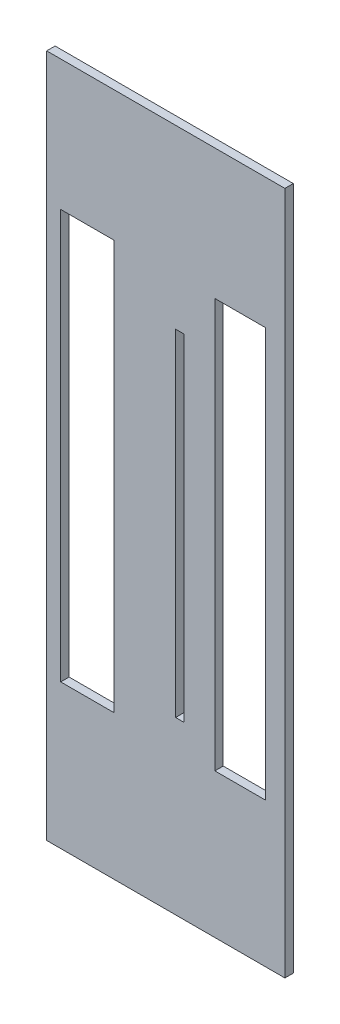
ISO-10303-21;
HEADER;
FILE_DESCRIPTION(('STEP AP214'),'2;1');
FILE_NAME('part.step','',(''),(''),'','','');
FILE_SCHEMA(('AUTOMOTIVE_DESIGN { 1 0 10303 214 1 1 1 1 }'));
ENDSEC;
DATA;
#1=APPLICATION_CONTEXT('core data for automotive mechanical design processes');
#2=APPLICATION_PROTOCOL_DEFINITION('international standard','automotive_design',2000,#1);
#3=PRODUCT_CONTEXT('',#1,'mechanical');
#4=PRODUCT('Part','Part','',(#3));
#5=PRODUCT_RELATED_PRODUCT_CATEGORY('part','',(#4));
#6=PRODUCT_DEFINITION_FORMATION('','',#4);
#7=PRODUCT_DEFINITION_CONTEXT('part definition',#1,'design');
#8=PRODUCT_DEFINITION('design','',#6,#7);
#9=PRODUCT_DEFINITION_SHAPE('','',#8);
#10=(LENGTH_UNIT() NAMED_UNIT(*) SI_UNIT(.MILLI.,.METRE.));
#11=(NAMED_UNIT(*) PLANE_ANGLE_UNIT() SI_UNIT($,.RADIAN.));
#12=(NAMED_UNIT(*) SI_UNIT($,.STERADIAN.) SOLID_ANGLE_UNIT());
#13=UNCERTAINTY_MEASURE_WITH_UNIT(LENGTH_MEASURE(1.E-05),#10,'distance_accuracy_value','');
#14=(GEOMETRIC_REPRESENTATION_CONTEXT(3) GLOBAL_UNCERTAINTY_ASSIGNED_CONTEXT((#13)) GLOBAL_UNIT_ASSIGNED_CONTEXT((#10,
#11,#12)) REPRESENTATION_CONTEXT('',''));
#15=CARTESIAN_POINT('',(0.,0.,0.));
#16=DIRECTION('',(0.,0.,1.));
#17=DIRECTION('',(1.,0.,0.));
#18=AXIS2_PLACEMENT_3D('',#15,#16,#17);
#19=CARTESIAN_POINT('',(193.,254.5,160.));
#20=DIRECTION('',(0.,0.,-1.));
#21=DIRECTION('',(-1.,0.,0.));
#22=AXIS2_PLACEMENT_3D('',#19,#20,#21);
#23=PLANE('',#22);
#24=DIRECTION('',(0.,1.,0.));
#25=VECTOR('',#24,1.);
#26=CARTESIAN_POINT('',(208.,81.4999999999999,160.));
#27=LINE('',#26,#25);
#28=CARTESIAN_POINT('',(208.,203.5,160.));
#29=VERTEX_POINT('',#28);
#30=CARTESIAN_POINT('',(208.,57.4999999999999,160.));
#31=VERTEX_POINT('',#30);
#32=EDGE_CURVE('E176',#29,#31,#27,.F.);
#33=ORIENTED_EDGE('',*,*,#32,.T.);
#34=DIRECTION('',(1.,0.,0.));
#35=VECTOR('',#34,1.);
#36=CARTESIAN_POINT('',(240.,57.4999999999999,160.));
#37=LINE('',#36,#35);
#38=CARTESIAN_POINT('',(227.,57.4999999999999,160.));
#39=VERTEX_POINT('',#38);
#40=EDGE_CURVE('E190',#39,#31,#37,.F.);
#41=ORIENTED_EDGE('',*,*,#40,.F.);
#42=DIRECTION('',(0.,1.,0.));
#43=VECTOR('',#42,1.);
#44=CARTESIAN_POINT('',(227.,171.5,160.));
#45=LINE('',#44,#43);
#46=CARTESIAN_POINT('',(227.,203.5,160.));
#47=VERTEX_POINT('',#46);
#48=EDGE_CURVE('E185',#47,#39,#45,.F.);
#49=ORIENTED_EDGE('',*,*,#48,.F.);
#50=DIRECTION('',(1.,0.,0.));
#51=VECTOR('',#50,1.);
#52=CARTESIAN_POINT('',(218.,203.5,160.));
#53=LINE('',#52,#51);
#54=EDGE_CURVE('E178',#47,#29,#53,.F.);
#55=ORIENTED_EDGE('',*,*,#54,.T.);
#56=EDGE_LOOP('',(#33,#41,#49,#55));
#57=FACE_BOUND('',#56,.T.);
#58=DIRECTION('',(0.,1.,0.));
#59=VECTOR('',#58,1.);
#60=CARTESIAN_POINT('',(263.,81.4999999999999,160.));
#61=LINE('',#60,#59);
#62=CARTESIAN_POINT('',(263.,57.4999999999999,160.));
#63=VERTEX_POINT('',#62);
#64=CARTESIAN_POINT('',(263.,203.5,160.));
#65=VERTEX_POINT('',#64);
#66=EDGE_CURVE('E206',#63,#65,#61,.T.);
#67=ORIENTED_EDGE('',*,*,#66,.F.);
#68=DIRECTION('',(1.,0.,0.));
#69=VECTOR('',#68,1.);
#70=CARTESIAN_POINT('',(278.,57.4999999999999,160.));
#71=LINE('',#70,#69);
#72=CARTESIAN_POINT('',(281.,57.4999999999999,160.));
#73=VERTEX_POINT('',#72);
#74=EDGE_CURVE('E201',#73,#63,#71,.F.);
#75=ORIENTED_EDGE('',*,*,#74,.F.);
#76=DIRECTION('',(0.,1.,0.));
#77=VECTOR('',#76,1.);
#78=CARTESIAN_POINT('',(281.,221.5,160.));
#79=LINE('',#78,#77);
#80=CARTESIAN_POINT('',(281.,203.5,160.));
#81=VERTEX_POINT('',#80);
#82=EDGE_CURVE('E196',#73,#81,#79,.T.);
#83=ORIENTED_EDGE('',*,*,#82,.T.);
#84=DIRECTION('',(1.,0.,0.));
#85=VECTOR('',#84,1.);
#86=CARTESIAN_POINT('',(256.,203.5,160.));
#87=LINE('',#86,#85);
#88=EDGE_CURVE('E211',#81,#65,#87,.F.);
#89=ORIENTED_EDGE('',*,*,#88,.T.);
#90=EDGE_LOOP('',(#67,#75,#83,#89));
#91=FACE_BOUND('',#90,.T.);
#92=DIRECTION('',(1.,0.,0.));
#93=VECTOR('',#92,1.);
#94=CARTESIAN_POINT('',(249.,187.,160.));
#95=LINE('',#94,#93);
#96=CARTESIAN_POINT('',(252.,187.,160.));
#97=VERTEX_POINT('',#96);
#98=CARTESIAN_POINT('',(249.,187.,160.));
#99=VERTEX_POINT('',#98);
#100=EDGE_CURVE('E165',#97,#99,#95,.F.);
#101=ORIENTED_EDGE('',*,*,#100,.T.);
#102=DIRECTION('',(0.,1.,0.));
#103=VECTOR('',#102,1.);
#104=CARTESIAN_POINT('',(249.,126.,160.));
#105=LINE('',#104,#103);
#106=CARTESIAN_POINT('',(249.,67.,160.));
#107=VERTEX_POINT('',#106);
#108=EDGE_CURVE('E162',#107,#99,#105,.T.);
#109=ORIENTED_EDGE('',*,*,#108,.F.);
#110=DIRECTION('',(1.,0.,0.));
#111=VECTOR('',#110,1.);
#112=CARTESIAN_POINT('',(249.,67.,160.));
#113=LINE('',#112,#111);
#114=CARTESIAN_POINT('',(252.,67.,160.));
#115=VERTEX_POINT('',#114);
#116=EDGE_CURVE('E157',#115,#107,#113,.F.);
#117=ORIENTED_EDGE('',*,*,#116,.F.);
#118=DIRECTION('',(0.,1.,0.));
#119=VECTOR('',#118,1.);
#120=CARTESIAN_POINT('',(252.,126.,160.));
#121=LINE('',#120,#119);
#122=EDGE_CURVE('E172',#115,#97,#121,.T.);
#123=ORIENTED_EDGE('',*,*,#122,.T.);
#124=EDGE_LOOP('',(#101,#109,#117,#123));
#125=FACE_BOUND('',#124,.T.);
#126=DIRECTION('',(1.,0.,0.));
#127=VECTOR('',#126,1.);
#128=CARTESIAN_POINT('',(293.,5.99999999999996,160.));
#129=LINE('',#128,#127);
#130=CARTESIAN_POINT('',(288.,5.99999999999997,160.));
#131=VERTEX_POINT('',#130);
#132=CARTESIAN_POINT('',(203.,5.99999999999996,160.));
#133=VERTEX_POINT('',#132);
#134=EDGE_CURVE('E140',#131,#133,#129,.F.);
#135=ORIENTED_EDGE('',*,*,#134,.T.);
#136=DIRECTION('',(0.,1.,0.));
#137=VECTOR('',#136,1.);
#138=CARTESIAN_POINT('',(203.,2.99999999999997,160.));
#139=LINE('',#138,#137);
#140=CARTESIAN_POINT('',(203.,250.,160.));
#141=VERTEX_POINT('',#140);
#142=EDGE_CURVE('E127',#141,#133,#139,.F.);
#143=ORIENTED_EDGE('',*,*,#142,.F.);
#144=DIRECTION('',(1.,0.,0.));
#145=VECTOR('',#144,1.);
#146=CARTESIAN_POINT('',(93.,250.,160.));
#147=LINE('',#146,#145);
#148=CARTESIAN_POINT('',(288.,250.,160.));
#149=VERTEX_POINT('',#148);
#150=EDGE_CURVE('E19',#141,#149,#147,.T.);
#151=ORIENTED_EDGE('',*,*,#150,.T.);
#152=DIRECTION('',(0.,1.,0.));
#153=VECTOR('',#152,1.);
#154=CARTESIAN_POINT('',(288.,253.,160.));
#155=LINE('',#154,#153);
#156=EDGE_CURVE('E155',#131,#149,#155,.T.);
#157=ORIENTED_EDGE('',*,*,#156,.F.);
#158=EDGE_LOOP('',(#135,#143,#151,#157));
#159=FACE_BOUND('',#158,.T.);
#160=ADVANCED_FACE('F16',(#57,#91,#125,#159),#23,.T.);
#161=CARTESIAN_POINT('',(93.,250.,163.));
#162=DIRECTION('',(0.,-1.,0.));
#163=DIRECTION('',(0.,0.,-1.));
#164=AXIS2_PLACEMENT_3D('',#161,#162,#163);
#165=PLANE('',#164);
#166=DIRECTION('',(0.,0.,-1.));
#167=VECTOR('',#166,1.);
#168=CARTESIAN_POINT('',(288.,250.,163.));
#169=LINE('',#168,#167);
#170=CARTESIAN_POINT('',(288.,250.,163.));
#171=VERTEX_POINT('',#170);
#172=EDGE_CURVE('E136',#149,#171,#169,.F.);
#173=ORIENTED_EDGE('',*,*,#172,.F.);
#174=ORIENTED_EDGE('',*,*,#150,.F.);
#175=DIRECTION('',(0.,0.,1.));
#176=VECTOR('',#175,1.);
#177=CARTESIAN_POINT('',(203.,250.,163.));
#178=LINE('',#177,#176);
#179=CARTESIAN_POINT('',(203.,250.,163.));
#180=VERTEX_POINT('',#179);
#181=EDGE_CURVE('E133',#180,#141,#178,.F.);
#182=ORIENTED_EDGE('',*,*,#181,.F.);
#183=DIRECTION('',(1.,0.,0.));
#184=VECTOR('',#183,1.);
#185=CARTESIAN_POINT('',(193.,250.,163.));
#186=LINE('',#185,#184);
#187=EDGE_CURVE('E214',#171,#180,#186,.F.);
#188=ORIENTED_EDGE('',*,*,#187,.F.);
#189=EDGE_LOOP('',(#173,#174,#182,#188));
#190=FACE_BOUND('',#189,.T.);
#191=ADVANCED_FACE('F132',(#190),#165,.F.);
#192=CARTESIAN_POINT('',(203.,2.99999999999997,163.));
#193=DIRECTION('',(-1.,0.,0.));
#194=DIRECTION('',(0.,0.,1.));
#195=AXIS2_PLACEMENT_3D('',#192,#193,#194);
#196=PLANE('',#195);
#197=DIRECTION('',(0.,0.,1.));
#198=VECTOR('',#197,1.);
#199=CARTESIAN_POINT('',(203.,5.99999999999996,163.));
#200=LINE('',#199,#198);
#201=CARTESIAN_POINT('',(203.,5.99999999999996,163.));
#202=VERTEX_POINT('',#201);
#203=EDGE_CURVE('E142',#133,#202,#200,.T.);
#204=ORIENTED_EDGE('',*,*,#203,.T.);
#205=DIRECTION('',(0.,-1.,0.));
#206=VECTOR('',#205,1.);
#207=CARTESIAN_POINT('',(203.,254.5,163.));
#208=LINE('',#207,#206);
#209=EDGE_CURVE('E146',#180,#202,#208,.T.);
#210=ORIENTED_EDGE('',*,*,#209,.F.);
#211=ORIENTED_EDGE('',*,*,#181,.T.);
#212=ORIENTED_EDGE('',*,*,#142,.T.);
#213=EDGE_LOOP('',(#204,#210,#211,#212));
#214=FACE_BOUND('',#213,.T.);
#215=ADVANCED_FACE('F144',(#214),#196,.T.);
#216=CARTESIAN_POINT('',(293.,5.99999999999996,163.));
#217=DIRECTION('',(0.,1.,0.));
#218=DIRECTION('',(0.,0.,1.));
#219=AXIS2_PLACEMENT_3D('',#216,#217,#218);
#220=PLANE('',#219);
#221=DIRECTION('',(0.,0.,-1.));
#222=VECTOR('',#221,1.);
#223=CARTESIAN_POINT('',(288.,5.99999999999998,163.));
#224=LINE('',#223,#222);
#225=CARTESIAN_POINT('',(288.,5.99999999999996,163.));
#226=VERTEX_POINT('',#225);
#227=EDGE_CURVE('E152',#226,#131,#224,.T.);
#228=ORIENTED_EDGE('',*,*,#227,.F.);
#229=DIRECTION('',(1.,0.,0.));
#230=VECTOR('',#229,1.);
#231=CARTESIAN_POINT('',(193.,5.99999999999995,163.));
#232=LINE('',#231,#230);
#233=EDGE_CURVE('E217',#202,#226,#232,.T.);
#234=ORIENTED_EDGE('',*,*,#233,.F.);
#235=ORIENTED_EDGE('',*,*,#203,.F.);
#236=ORIENTED_EDGE('',*,*,#134,.F.);
#237=EDGE_LOOP('',(#228,#234,#235,#236));
#238=FACE_BOUND('',#237,.T.);
#239=ADVANCED_FACE('F398',(#238),#220,.F.);
#240=CARTESIAN_POINT('',(288.,253.,163.));
#241=DIRECTION('',(1.,0.,0.));
#242=DIRECTION('',(0.,0.,-1.));
#243=AXIS2_PLACEMENT_3D('',#240,#241,#242);
#244=PLANE('',#243);
#245=ORIENTED_EDGE('',*,*,#227,.T.);
#246=ORIENTED_EDGE('',*,*,#156,.T.);
#247=ORIENTED_EDGE('',*,*,#172,.T.);
#248=DIRECTION('',(0.,-1.,0.));
#249=VECTOR('',#248,1.);
#250=CARTESIAN_POINT('',(288.,254.5,163.));
#251=LINE('',#250,#249);
#252=EDGE_CURVE('E220',#226,#171,#251,.F.);
#253=ORIENTED_EDGE('',*,*,#252,.F.);
#254=EDGE_LOOP('',(#245,#246,#247,#253));
#255=FACE_BOUND('',#254,.T.);
#256=ADVANCED_FACE('F389',(#255),#244,.T.);
#257=CARTESIAN_POINT('',(249.,67.,175.));
#258=DIRECTION('',(0.,1.,0.));
#259=DIRECTION('',(0.,0.,1.));
#260=AXIS2_PLACEMENT_3D('',#257,#258,#259);
#261=PLANE('',#260);
#262=ORIENTED_EDGE('',*,*,#116,.T.);
#263=DIRECTION('',(0.,0.,-1.));
#264=VECTOR('',#263,1.);
#265=CARTESIAN_POINT('',(249.,67.,167.5));
#266=LINE('',#265,#264);
#267=CARTESIAN_POINT('',(249.,67.,163.));
#268=VERTEX_POINT('',#267);
#269=EDGE_CURVE('E159',#268,#107,#266,.T.);
#270=ORIENTED_EDGE('',*,*,#269,.F.);
#271=DIRECTION('',(1.,0.,0.));
#272=VECTOR('',#271,1.);
#273=CARTESIAN_POINT('',(193.,67.,163.));
#274=LINE('',#273,#272);
#275=CARTESIAN_POINT('',(252.,67.,163.));
#276=VERTEX_POINT('',#275);
#277=EDGE_CURVE('E223',#276,#268,#274,.F.);
#278=ORIENTED_EDGE('',*,*,#277,.F.);
#279=DIRECTION('',(0.,0.,-1.));
#280=VECTOR('',#279,1.);
#281=CARTESIAN_POINT('',(252.,67.,167.5));
#282=LINE('',#281,#280);
#283=EDGE_CURVE('E169',#276,#115,#282,.T.);
#284=ORIENTED_EDGE('',*,*,#283,.T.);
#285=EDGE_LOOP('',(#262,#270,#278,#284));
#286=FACE_BOUND('',#285,.T.);
#287=ADVANCED_FACE('F380',(#286),#261,.T.);
#288=CARTESIAN_POINT('',(249.,126.,167.5));
#289=DIRECTION('',(1.,0.,0.));
#290=DIRECTION('',(0.,0.,-1.));
#291=AXIS2_PLACEMENT_3D('',#288,#289,#290);
#292=PLANE('',#291);
#293=ORIENTED_EDGE('',*,*,#108,.T.);
#294=DIRECTION('',(0.,0.,1.));
#295=VECTOR('',#294,1.);
#296=CARTESIAN_POINT('',(249.,187.,160.));
#297=LINE('',#296,#295);
#298=CARTESIAN_POINT('',(249.,187.,163.));
#299=VERTEX_POINT('',#298);
#300=EDGE_CURVE('E167',#99,#299,#297,.T.);
#301=ORIENTED_EDGE('',*,*,#300,.T.);
#302=DIRECTION('',(0.,-1.,0.));
#303=VECTOR('',#302,1.);
#304=CARTESIAN_POINT('',(249.,254.5,163.));
#305=LINE('',#304,#303);
#306=EDGE_CURVE('E226',#268,#299,#305,.F.);
#307=ORIENTED_EDGE('',*,*,#306,.F.);
#308=ORIENTED_EDGE('',*,*,#269,.T.);
#309=EDGE_LOOP('',(#293,#301,#307,#308));
#310=FACE_BOUND('',#309,.T.);
#311=ADVANCED_FACE('F371',(#310),#292,.T.);
#312=CARTESIAN_POINT('',(249.,187.,160.));
#313=DIRECTION('',(0.,1.,0.));
#314=DIRECTION('',(0.,0.,1.));
#315=AXIS2_PLACEMENT_3D('',#312,#313,#314);
#316=PLANE('',#315);
#317=ORIENTED_EDGE('',*,*,#300,.F.);
#318=ORIENTED_EDGE('',*,*,#100,.F.);
#319=DIRECTION('',(0.,0.,-1.));
#320=VECTOR('',#319,1.);
#321=CARTESIAN_POINT('',(252.,187.,167.5));
#322=LINE('',#321,#320);
#323=CARTESIAN_POINT('',(252.,187.,163.));
#324=VERTEX_POINT('',#323);
#325=EDGE_CURVE('E174',#97,#324,#322,.F.);
#326=ORIENTED_EDGE('',*,*,#325,.T.);
#327=DIRECTION('',(1.,0.,0.));
#328=VECTOR('',#327,1.);
#329=CARTESIAN_POINT('',(193.,187.,163.));
#330=LINE('',#329,#328);
#331=EDGE_CURVE('E229',#299,#324,#330,.T.);
#332=ORIENTED_EDGE('',*,*,#331,.F.);
#333=EDGE_LOOP('',(#317,#318,#326,#332));
#334=FACE_BOUND('',#333,.T.);
#335=ADVANCED_FACE('F362',(#334),#316,.F.);
#336=CARTESIAN_POINT('',(252.,126.,167.5));
#337=DIRECTION('',(1.,0.,0.));
#338=DIRECTION('',(0.,0.,-1.));
#339=AXIS2_PLACEMENT_3D('',#336,#337,#338);
#340=PLANE('',#339);
#341=ORIENTED_EDGE('',*,*,#325,.F.);
#342=ORIENTED_EDGE('',*,*,#122,.F.);
#343=ORIENTED_EDGE('',*,*,#283,.F.);
#344=DIRECTION('',(0.,-1.,0.));
#345=VECTOR('',#344,1.);
#346=CARTESIAN_POINT('',(252.,254.5,163.));
#347=LINE('',#346,#345);
#348=EDGE_CURVE('E232',#324,#276,#347,.T.);
#349=ORIENTED_EDGE('',*,*,#348,.F.);
#350=EDGE_LOOP('',(#341,#342,#343,#349));
#351=FACE_BOUND('',#350,.T.);
#352=ADVANCED_FACE('F353',(#351),#340,.F.);
#353=CARTESIAN_POINT('',(208.,81.4999999999999,163.));
#354=DIRECTION('',(-1.,0.,0.));
#355=DIRECTION('',(0.,0.,1.));
#356=AXIS2_PLACEMENT_3D('',#353,#354,#355);
#357=PLANE('',#356);
#358=ORIENTED_EDGE('',*,*,#32,.F.);
#359=DIRECTION('',(0.,0.,1.));
#360=VECTOR('',#359,1.);
#361=CARTESIAN_POINT('',(208.,203.5,163.));
#362=LINE('',#361,#360);
#363=CARTESIAN_POINT('',(208.,203.5,163.));
#364=VERTEX_POINT('',#363);
#365=EDGE_CURVE('E180',#29,#364,#362,.T.);
#366=ORIENTED_EDGE('',*,*,#365,.T.);
#367=DIRECTION('',(0.,-1.,0.));
#368=VECTOR('',#367,1.);
#369=CARTESIAN_POINT('',(208.,254.5,163.));
#370=LINE('',#369,#368);
#371=CARTESIAN_POINT('',(208.,57.4999999999999,163.));
#372=VERTEX_POINT('',#371);
#373=EDGE_CURVE('E235',#372,#364,#370,.F.);
#374=ORIENTED_EDGE('',*,*,#373,.F.);
#375=DIRECTION('',(0.,0.,1.));
#376=VECTOR('',#375,1.);
#377=CARTESIAN_POINT('',(208.,57.4999999999999,163.));
#378=LINE('',#377,#376);
#379=EDGE_CURVE('E193',#31,#372,#378,.T.);
#380=ORIENTED_EDGE('',*,*,#379,.F.);
#381=EDGE_LOOP('',(#358,#366,#374,#380));
#382=FACE_BOUND('',#381,.T.);
#383=ADVANCED_FACE('F344',(#382),#357,.F.);
#384=CARTESIAN_POINT('',(218.,203.5,163.));
#385=DIRECTION('',(0.,1.,0.));
#386=DIRECTION('',(0.,0.,1.));
#387=AXIS2_PLACEMENT_3D('',#384,#385,#386);
#388=PLANE('',#387);
#389=DIRECTION('',(1.,0.,0.));
#390=VECTOR('',#389,1.);
#391=CARTESIAN_POINT('',(193.,203.5,163.));
#392=LINE('',#391,#390);
#393=CARTESIAN_POINT('',(227.,203.5,163.));
#394=VERTEX_POINT('',#393);
#395=EDGE_CURVE('E238',#364,#394,#392,.T.);
#396=ORIENTED_EDGE('',*,*,#395,.F.);
#397=ORIENTED_EDGE('',*,*,#365,.F.);
#398=ORIENTED_EDGE('',*,*,#54,.F.);
#399=DIRECTION('',(0.,0.,1.));
#400=VECTOR('',#399,1.);
#401=CARTESIAN_POINT('',(227.,203.5,163.));
#402=LINE('',#401,#400);
#403=EDGE_CURVE('E182',#394,#47,#402,.F.);
#404=ORIENTED_EDGE('',*,*,#403,.F.);
#405=EDGE_LOOP('',(#396,#397,#398,#404));
#406=FACE_BOUND('',#405,.T.);
#407=ADVANCED_FACE('F335',(#406),#388,.F.);
#408=CARTESIAN_POINT('',(227.,171.5,163.));
#409=DIRECTION('',(-1.,0.,0.));
#410=DIRECTION('',(0.,0.,1.));
#411=AXIS2_PLACEMENT_3D('',#408,#409,#410);
#412=PLANE('',#411);
#413=ORIENTED_EDGE('',*,*,#403,.T.);
#414=ORIENTED_EDGE('',*,*,#48,.T.);
#415=DIRECTION('',(0.,0.,1.));
#416=VECTOR('',#415,1.);
#417=CARTESIAN_POINT('',(227.,57.4999999999999,163.));
#418=LINE('',#417,#416);
#419=CARTESIAN_POINT('',(227.,57.4999999999999,163.));
#420=VERTEX_POINT('',#419);
#421=EDGE_CURVE('E187',#420,#39,#418,.F.);
#422=ORIENTED_EDGE('',*,*,#421,.F.);
#423=DIRECTION('',(0.,-1.,0.));
#424=VECTOR('',#423,1.);
#425=CARTESIAN_POINT('',(227.,254.5,163.));
#426=LINE('',#425,#424);
#427=EDGE_CURVE('E241',#394,#420,#426,.T.);
#428=ORIENTED_EDGE('',*,*,#427,.F.);
#429=EDGE_LOOP('',(#413,#414,#422,#428));
#430=FACE_BOUND('',#429,.T.);
#431=ADVANCED_FACE('F280',(#430),#412,.T.);
#432=CARTESIAN_POINT('',(240.,57.4999999999999,163.));
#433=DIRECTION('',(0.,1.,0.));
#434=DIRECTION('',(0.,0.,1.));
#435=AXIS2_PLACEMENT_3D('',#432,#433,#434);
#436=PLANE('',#435);
#437=ORIENTED_EDGE('',*,*,#379,.T.);
#438=DIRECTION('',(1.,0.,0.));
#439=VECTOR('',#438,1.);
#440=CARTESIAN_POINT('',(193.,57.4999999999999,163.));
#441=LINE('',#440,#439);
#442=EDGE_CURVE('E244',#420,#372,#441,.F.);
#443=ORIENTED_EDGE('',*,*,#442,.F.);
#444=ORIENTED_EDGE('',*,*,#421,.T.);
#445=ORIENTED_EDGE('',*,*,#40,.T.);
#446=EDGE_LOOP('',(#437,#443,#444,#445));
#447=FACE_BOUND('',#446,.T.);
#448=ADVANCED_FACE('F272',(#447),#436,.T.);
#449=CARTESIAN_POINT('',(281.,221.5,163.));
#450=DIRECTION('',(1.,0.,0.));
#451=DIRECTION('',(0.,0.,-1.));
#452=AXIS2_PLACEMENT_3D('',#449,#450,#451);
#453=PLANE('',#452);
#454=DIRECTION('',(0.,-1.,0.));
#455=VECTOR('',#454,1.);
#456=CARTESIAN_POINT('',(281.,254.5,163.));
#457=LINE('',#456,#455);
#458=CARTESIAN_POINT('',(281.,203.5,163.));
#459=VERTEX_POINT('',#458);
#460=CARTESIAN_POINT('',(281.,57.4999999999999,163.));
#461=VERTEX_POINT('',#460);
#462=EDGE_CURVE('E247',#459,#461,#457,.T.);
#463=ORIENTED_EDGE('',*,*,#462,.F.);
#464=DIRECTION('',(0.,0.,1.));
#465=VECTOR('',#464,1.);
#466=CARTESIAN_POINT('',(281.,203.5,163.));
#467=LINE('',#466,#465);
#468=EDGE_CURVE('E208',#459,#81,#467,.F.);
#469=ORIENTED_EDGE('',*,*,#468,.T.);
#470=ORIENTED_EDGE('',*,*,#82,.F.);
#471=DIRECTION('',(0.,0.,1.));
#472=VECTOR('',#471,1.);
#473=CARTESIAN_POINT('',(281.,57.4999999999999,163.));
#474=LINE('',#473,#472);
#475=EDGE_CURVE('E198',#461,#73,#474,.F.);
#476=ORIENTED_EDGE('',*,*,#475,.F.);
#477=EDGE_LOOP('',(#463,#469,#470,#476));
#478=FACE_BOUND('',#477,.T.);
#479=ADVANCED_FACE('F270',(#478),#453,.F.);
#480=CARTESIAN_POINT('',(278.,57.4999999999999,163.));
#481=DIRECTION('',(0.,1.,0.));
#482=DIRECTION('',(0.,0.,1.));
#483=AXIS2_PLACEMENT_3D('',#480,#481,#482);
#484=PLANE('',#483);
#485=ORIENTED_EDGE('',*,*,#475,.T.);
#486=ORIENTED_EDGE('',*,*,#74,.T.);
#487=DIRECTION('',(0.,0.,-1.));
#488=VECTOR('',#487,1.);
#489=CARTESIAN_POINT('',(263.,57.4999999999999,163.));
#490=LINE('',#489,#488);
#491=CARTESIAN_POINT('',(263.,57.4999999999999,163.));
#492=VERTEX_POINT('',#491);
#493=EDGE_CURVE('E203',#492,#63,#490,.T.);
#494=ORIENTED_EDGE('',*,*,#493,.F.);
#495=DIRECTION('',(1.,0.,0.));
#496=VECTOR('',#495,1.);
#497=CARTESIAN_POINT('',(193.,57.4999999999999,163.));
#498=LINE('',#497,#496);
#499=EDGE_CURVE('E250',#461,#492,#498,.F.);
#500=ORIENTED_EDGE('',*,*,#499,.F.);
#501=EDGE_LOOP('',(#485,#486,#494,#500));
#502=FACE_BOUND('',#501,.T.);
#503=ADVANCED_FACE('F261',(#502),#484,.T.);
#504=CARTESIAN_POINT('',(263.,81.4999999999999,163.));
#505=DIRECTION('',(1.,0.,0.));
#506=DIRECTION('',(0.,0.,-1.));
#507=AXIS2_PLACEMENT_3D('',#504,#505,#506);
#508=PLANE('',#507);
#509=DIRECTION('',(0.,0.,1.));
#510=VECTOR('',#509,1.);
#511=CARTESIAN_POINT('',(263.,203.5,163.));
#512=LINE('',#511,#510);
#513=CARTESIAN_POINT('',(263.,203.5,163.));
#514=VERTEX_POINT('',#513);
#515=EDGE_CURVE('E34',#65,#514,#512,.T.);
#516=ORIENTED_EDGE('',*,*,#515,.T.);
#517=DIRECTION('',(0.,-1.,0.));
#518=VECTOR('',#517,1.);
#519=CARTESIAN_POINT('',(263.,254.5,163.));
#520=LINE('',#519,#518);
#521=EDGE_CURVE('E25',#492,#514,#520,.F.);
#522=ORIENTED_EDGE('',*,*,#521,.F.);
#523=ORIENTED_EDGE('',*,*,#493,.T.);
#524=ORIENTED_EDGE('',*,*,#66,.T.);
#525=EDGE_LOOP('',(#516,#522,#523,#524));
#526=FACE_BOUND('',#525,.T.);
#527=ADVANCED_FACE('F258',(#526),#508,.T.);
#528=CARTESIAN_POINT('',(256.,203.5,163.));
#529=DIRECTION('',(0.,1.,0.));
#530=DIRECTION('',(0.,0.,1.));
#531=AXIS2_PLACEMENT_3D('',#528,#529,#530);
#532=PLANE('',#531);
#533=ORIENTED_EDGE('',*,*,#88,.F.);
#534=ORIENTED_EDGE('',*,*,#468,.F.);
#535=DIRECTION('',(1.,0.,0.));
#536=VECTOR('',#535,1.);
#537=CARTESIAN_POINT('',(193.,203.5,163.));
#538=LINE('',#537,#536);
#539=EDGE_CURVE('E10',#514,#459,#538,.T.);
#540=ORIENTED_EDGE('',*,*,#539,.F.);
#541=ORIENTED_EDGE('',*,*,#515,.F.);
#542=EDGE_LOOP('',(#533,#534,#540,#541));
#543=FACE_BOUND('',#542,.T.);
#544=ADVANCED_FACE('F268',(#543),#532,.F.);
#545=CARTESIAN_POINT('',(193.,254.5,163.));
#546=DIRECTION('',(0.,0.,1.));
#547=DIRECTION('',(0.,-1.,0.));
#548=AXIS2_PLACEMENT_3D('',#545,#546,#547);
#549=PLANE('',#548);
#550=ORIENTED_EDGE('',*,*,#521,.T.);
#551=ORIENTED_EDGE('',*,*,#539,.T.);
#552=ORIENTED_EDGE('',*,*,#462,.T.);
#553=ORIENTED_EDGE('',*,*,#499,.T.);
#554=EDGE_LOOP('',(#550,#551,#552,#553));
#555=FACE_BOUND('',#554,.T.);
#556=ORIENTED_EDGE('',*,*,#427,.T.);
#557=ORIENTED_EDGE('',*,*,#442,.T.);
#558=ORIENTED_EDGE('',*,*,#373,.T.);
#559=ORIENTED_EDGE('',*,*,#395,.T.);
#560=EDGE_LOOP('',(#556,#557,#558,#559));
#561=FACE_BOUND('',#560,.T.);
#562=ORIENTED_EDGE('',*,*,#331,.T.);
#563=ORIENTED_EDGE('',*,*,#348,.T.);
#564=ORIENTED_EDGE('',*,*,#277,.T.);
#565=ORIENTED_EDGE('',*,*,#306,.T.);
#566=EDGE_LOOP('',(#562,#563,#564,#565));
#567=FACE_BOUND('',#566,.T.);
#568=ORIENTED_EDGE('',*,*,#233,.T.);
#569=ORIENTED_EDGE('',*,*,#252,.T.);
#570=ORIENTED_EDGE('',*,*,#187,.T.);
#571=ORIENTED_EDGE('',*,*,#209,.T.);
#572=EDGE_LOOP('',(#568,#569,#570,#571));
#573=FACE_BOUND('',#572,.T.);
#574=ADVANCED_FACE('F255',(#555,#561,#567,#573),#549,.T.);
#575=CLOSED_SHELL('',(#160,#191,#215,#239,#256,#287,#311,#335,#352,#383,#407,#431,#448,#479,
#503,#527,#544,#574));
#576=MANIFOLD_SOLID_BREP('B1',#575);
#577=ADVANCED_BREP_SHAPE_REPRESENTATION('',(#18,#576),#14);
#578=SHAPE_DEFINITION_REPRESENTATION(#9,#577);
ENDSEC;
END-ISO-10303-21;
